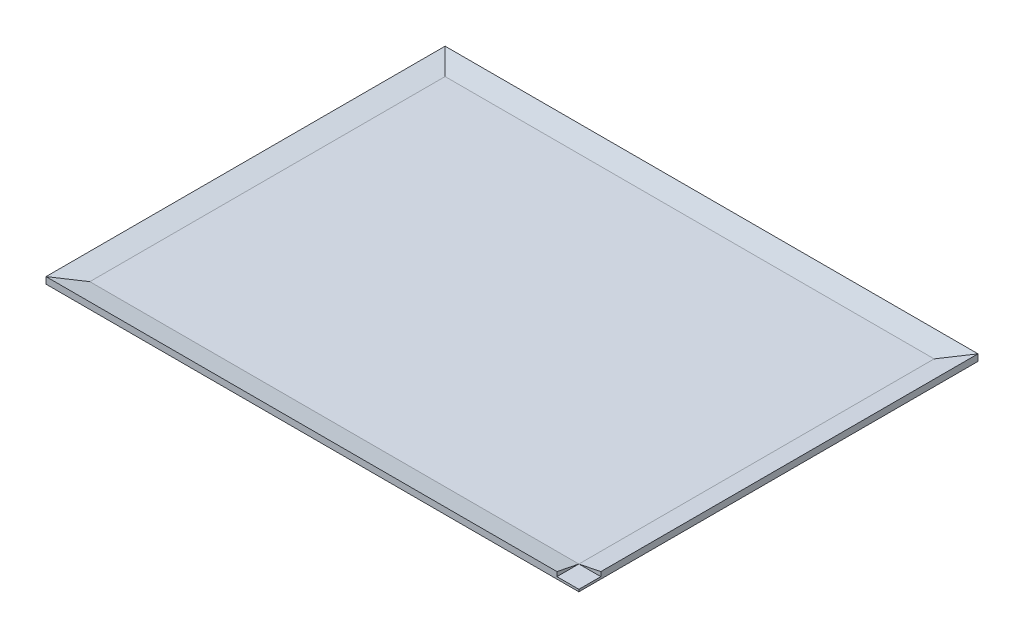
ISO-10303-21;
HEADER;
FILE_DESCRIPTION(('STEP AP214'),'2;1');
FILE_NAME('part.step','',(''),(''),'','','');
FILE_SCHEMA(('AUTOMOTIVE_DESIGN { 1 0 10303 214 1 1 1 1 }'));
ENDSEC;
DATA;
#1=APPLICATION_CONTEXT('core data for automotive mechanical design processes');
#2=APPLICATION_PROTOCOL_DEFINITION('international standard','automotive_design',2000,#1);
#3=PRODUCT_CONTEXT('',#1,'mechanical');
#4=PRODUCT('Part','Part','',(#3));
#5=PRODUCT_RELATED_PRODUCT_CATEGORY('part','',(#4));
#6=PRODUCT_DEFINITION_FORMATION('','',#4);
#7=PRODUCT_DEFINITION_CONTEXT('part definition',#1,'design');
#8=PRODUCT_DEFINITION('design','',#6,#7);
#9=PRODUCT_DEFINITION_SHAPE('','',#8);
#10=(LENGTH_UNIT() NAMED_UNIT(*) SI_UNIT(.MILLI.,.METRE.));
#11=(NAMED_UNIT(*) PLANE_ANGLE_UNIT() SI_UNIT($,.RADIAN.));
#12=(NAMED_UNIT(*) SI_UNIT($,.STERADIAN.) SOLID_ANGLE_UNIT());
#13=UNCERTAINTY_MEASURE_WITH_UNIT(LENGTH_MEASURE(1.E-05),#10,'distance_accuracy_value','');
#14=(GEOMETRIC_REPRESENTATION_CONTEXT(3) GLOBAL_UNCERTAINTY_ASSIGNED_CONTEXT((#13)) GLOBAL_UNIT_ASSIGNED_CONTEXT((#10,
#11,#12)) REPRESENTATION_CONTEXT('',''));
#15=CARTESIAN_POINT('',(0.,0.,0.));
#16=DIRECTION('',(0.,0.,1.));
#17=DIRECTION('',(1.,0.,0.));
#18=AXIS2_PLACEMENT_3D('',#15,#16,#17);
#19=CARTESIAN_POINT('',(0.,0.,0.));
#20=DIRECTION('',(0.,1.,0.));
#21=DIRECTION('',(0.,0.,1.));
#22=AXIS2_PLACEMENT_3D('',#19,#20,#21);
#23=PLANE('',#22);
#24=DIRECTION('',(-1.,0.,0.));
#25=VECTOR('',#24,1.);
#26=CARTESIAN_POINT('',(1115.,0.,810.));
#27=LINE('',#26,#25);
#28=CARTESIAN_POINT('',(1115.,0.,810.));
#29=VERTEX_POINT('',#28);
#30=CARTESIAN_POINT('',(-1115.,0.,810.));
#31=VERTEX_POINT('',#30);
#32=EDGE_CURVE('E145',#29,#31,#27,.T.);
#33=ORIENTED_EDGE('',*,*,#32,.F.);
#34=DIRECTION('',(0.,0.,1.));
#35=VECTOR('',#34,1.);
#36=CARTESIAN_POINT('',(1115.,0.,-920.1));
#37=LINE('',#36,#35);
#38=CARTESIAN_POINT('',(1115.,0.,-810.));
#39=VERTEX_POINT('',#38);
#40=EDGE_CURVE('E125',#39,#29,#37,.T.);
#41=ORIENTED_EDGE('',*,*,#40,.F.);
#42=DIRECTION('',(1.,0.,0.));
#43=VECTOR('',#42,1.);
#44=CARTESIAN_POINT('',(-1225.1,0.,-810.));
#45=LINE('',#44,#43);
#46=CARTESIAN_POINT('',(-1115.,0.,-810.));
#47=VERTEX_POINT('',#46);
#48=EDGE_CURVE('E118',#47,#39,#45,.T.);
#49=ORIENTED_EDGE('',*,*,#48,.F.);
#50=DIRECTION('',(0.,0.,-1.));
#51=VECTOR('',#50,1.);
#52=CARTESIAN_POINT('',(-1115.,0.,920.1));
#53=LINE('',#52,#51);
#54=EDGE_CURVE('E54',#31,#47,#53,.T.);
#55=ORIENTED_EDGE('',*,*,#54,.F.);
#56=EDGE_LOOP('',(#33,#41,#49,#55));
#57=FACE_BOUND('',#56,.T.);
#58=ADVANCED_FACE('F37',(#57),#23,.T.);
#59=CARTESIAN_POINT('',(-1215.,-10.,-910.));
#60=DIRECTION('',(-1.,0.,0.));
#61=DIRECTION('',(0.,0.,1.));
#62=AXIS2_PLACEMENT_3D('',#59,#60,#61);
#63=PLANE('',#62);
#64=DIRECTION('',(0.,0.,-1.));
#65=VECTOR('',#64,1.);
#66=CARTESIAN_POINT('',(-1215.,20.,920.1));
#67=LINE('',#66,#65);
#68=CARTESIAN_POINT('',(-1215.,20.,910.));
#69=VERTEX_POINT('',#68);
#70=CARTESIAN_POINT('',(-1215.,20.,-910.));
#71=VERTEX_POINT('',#70);
#72=EDGE_CURVE('E112',#69,#71,#67,.T.);
#73=ORIENTED_EDGE('',*,*,#72,.T.);
#74=DIRECTION('',(0.,1.,0.));
#75=VECTOR('',#74,1.);
#76=CARTESIAN_POINT('',(-1215.,-10.,-910.));
#77=LINE('',#76,#75);
#78=CARTESIAN_POINT('',(-1215.,-10.,-910.));
#79=VERTEX_POINT('',#78);
#80=EDGE_CURVE('E11',#79,#71,#77,.T.);
#81=ORIENTED_EDGE('',*,*,#80,.F.);
#82=DIRECTION('',(0.,0.,1.));
#83=VECTOR('',#82,1.);
#84=CARTESIAN_POINT('',(-1215.,-10.,-910.));
#85=LINE('',#84,#83);
#86=CARTESIAN_POINT('',(-1215.,-10.,910.));
#87=VERTEX_POINT('',#86);
#88=EDGE_CURVE('E156',#79,#87,#85,.T.);
#89=ORIENTED_EDGE('',*,*,#88,.T.);
#90=DIRECTION('',(0.,1.,0.));
#91=VECTOR('',#90,1.);
#92=CARTESIAN_POINT('',(-1215.,-10.,910.));
#93=LINE('',#92,#91);
#94=EDGE_CURVE('E41',#87,#69,#93,.T.);
#95=ORIENTED_EDGE('',*,*,#94,.T.);
#96=EDGE_LOOP('',(#73,#81,#89,#95));
#97=FACE_BOUND('',#96,.T.);
#98=ADVANCED_FACE('F39',(#97),#63,.T.);
#99=CARTESIAN_POINT('',(1215.,-10.,-910.));
#100=DIRECTION('',(0.,0.,-1.));
#101=DIRECTION('',(-1.,0.,0.));
#102=AXIS2_PLACEMENT_3D('',#99,#100,#101);
#103=PLANE('',#102);
#104=ORIENTED_EDGE('',*,*,#80,.T.);
#105=DIRECTION('',(1.,0.,0.));
#106=VECTOR('',#105,1.);
#107=CARTESIAN_POINT('',(-1225.1,20.,-910.));
#108=LINE('',#107,#106);
#109=CARTESIAN_POINT('',(1215.,20.,-910.));
#110=VERTEX_POINT('',#109);
#111=EDGE_CURVE('E121',#71,#110,#108,.T.);
#112=ORIENTED_EDGE('',*,*,#111,.T.);
#113=DIRECTION('',(0.,1.,0.));
#114=VECTOR('',#113,1.);
#115=CARTESIAN_POINT('',(1215.,-10.,-910.));
#116=LINE('',#115,#114);
#117=CARTESIAN_POINT('',(1215.,-10.,-910.));
#118=VERTEX_POINT('',#117);
#119=EDGE_CURVE('E46',#118,#110,#116,.T.);
#120=ORIENTED_EDGE('',*,*,#119,.F.);
#121=DIRECTION('',(-1.,0.,0.));
#122=VECTOR('',#121,1.);
#123=CARTESIAN_POINT('',(1215.,-10.,-910.));
#124=LINE('',#123,#122);
#125=EDGE_CURVE('E166',#118,#79,#124,.T.);
#126=ORIENTED_EDGE('',*,*,#125,.T.);
#127=EDGE_LOOP('',(#104,#112,#120,#126));
#128=FACE_BOUND('',#127,.T.);
#129=ADVANCED_FACE('F204',(#128),#103,.T.);
#130=CARTESIAN_POINT('',(1215.,-10.,910.));
#131=DIRECTION('',(1.,0.,0.));
#132=DIRECTION('',(0.,0.,-1.));
#133=AXIS2_PLACEMENT_3D('',#130,#131,#132);
#134=PLANE('',#133);
#135=DIRECTION('',(0.,0.,-1.));
#136=VECTOR('',#135,1.);
#137=CARTESIAN_POINT('',(1215.,0.,910.));
#138=LINE('',#137,#136);
#139=CARTESIAN_POINT('',(1215.,0.,910.));
#140=VERTEX_POINT('',#139);
#141=CARTESIAN_POINT('',(1215.,0.,810.));
#142=VERTEX_POINT('',#141);
#143=EDGE_CURVE('E160',#140,#142,#138,.T.);
#144=ORIENTED_EDGE('',*,*,#143,.F.);
#145=DIRECTION('',(0.,1.,0.));
#146=VECTOR('',#145,1.);
#147=CARTESIAN_POINT('',(1215.,-10.,910.));
#148=LINE('',#147,#146);
#149=CARTESIAN_POINT('',(1215.,-10.,910.));
#150=VERTEX_POINT('',#149);
#151=EDGE_CURVE('E172',#150,#140,#148,.T.);
#152=ORIENTED_EDGE('',*,*,#151,.F.);
#153=DIRECTION('',(0.,0.,-1.));
#154=VECTOR('',#153,1.);
#155=CARTESIAN_POINT('',(1215.,-10.,910.));
#156=LINE('',#155,#154);
#157=EDGE_CURVE('E163',#150,#118,#156,.T.);
#158=ORIENTED_EDGE('',*,*,#157,.T.);
#159=ORIENTED_EDGE('',*,*,#119,.T.);
#160=DIRECTION('',(0.,0.,1.));
#161=VECTOR('',#160,1.);
#162=CARTESIAN_POINT('',(1215.,20.,-920.1));
#163=LINE('',#162,#161);
#164=CARTESIAN_POINT('',(1215.,20.,810.));
#165=VERTEX_POINT('',#164);
#166=EDGE_CURVE('E136',#110,#165,#163,.T.);
#167=ORIENTED_EDGE('',*,*,#166,.T.);
#168=DIRECTION('',(0.,-1.,0.));
#169=VECTOR('',#168,1.);
#170=CARTESIAN_POINT('',(1215.,20.,810.));
#171=LINE('',#170,#169);
#172=EDGE_CURVE('E130',#165,#142,#171,.T.);
#173=ORIENTED_EDGE('',*,*,#172,.T.);
#174=EDGE_LOOP('',(#144,#152,#158,#159,#167,#173));
#175=FACE_BOUND('',#174,.T.);
#176=ADVANCED_FACE('F208',(#175),#134,.T.);
#177=CARTESIAN_POINT('',(-1215.,-10.,910.));
#178=DIRECTION('',(0.,0.,1.));
#179=DIRECTION('',(1.,0.,0.));
#180=AXIS2_PLACEMENT_3D('',#177,#178,#179);
#181=PLANE('',#180);
#182=DIRECTION('',(1.,0.,0.));
#183=VECTOR('',#182,1.);
#184=CARTESIAN_POINT('',(-1215.,0.,910.));
#185=LINE('',#184,#183);
#186=CARTESIAN_POINT('',(1115.,0.,910.));
#187=VERTEX_POINT('',#186);
#188=EDGE_CURVE('E141',#187,#140,#185,.T.);
#189=ORIENTED_EDGE('',*,*,#188,.F.);
#190=DIRECTION('',(0.,-1.,0.));
#191=VECTOR('',#190,1.);
#192=CARTESIAN_POINT('',(1115.,20.,910.));
#193=LINE('',#192,#191);
#194=CARTESIAN_POINT('',(1115.,20.,910.));
#195=VERTEX_POINT('',#194);
#196=EDGE_CURVE('E147',#195,#187,#193,.T.);
#197=ORIENTED_EDGE('',*,*,#196,.F.);
#198=DIRECTION('',(-1.,0.,0.));
#199=VECTOR('',#198,1.);
#200=CARTESIAN_POINT('',(1115.,20.,910.));
#201=LINE('',#200,#199);
#202=EDGE_CURVE('E142',#195,#69,#201,.T.);
#203=ORIENTED_EDGE('',*,*,#202,.T.);
#204=ORIENTED_EDGE('',*,*,#94,.F.);
#205=DIRECTION('',(1.,0.,0.));
#206=VECTOR('',#205,1.);
#207=CARTESIAN_POINT('',(-1215.,-10.,910.));
#208=LINE('',#207,#206);
#209=EDGE_CURVE('E159',#87,#150,#208,.T.);
#210=ORIENTED_EDGE('',*,*,#209,.T.);
#211=ORIENTED_EDGE('',*,*,#151,.T.);
#212=EDGE_LOOP('',(#189,#197,#203,#204,#210,#211));
#213=FACE_BOUND('',#212,.T.);
#214=ADVANCED_FACE('F183',(#213),#181,.T.);
#215=CARTESIAN_POINT('',(0.,-10.,0.));
#216=DIRECTION('',(0.,1.,0.));
#217=DIRECTION('',(0.,0.,1.));
#218=AXIS2_PLACEMENT_3D('',#215,#216,#217);
#219=PLANE('',#218);
#220=ORIENTED_EDGE('',*,*,#88,.F.);
#221=ORIENTED_EDGE('',*,*,#125,.F.);
#222=ORIENTED_EDGE('',*,*,#157,.F.);
#223=ORIENTED_EDGE('',*,*,#209,.F.);
#224=EDGE_LOOP('',(#220,#221,#222,#223));
#225=FACE_BOUND('',#224,.T.);
#226=ADVANCED_FACE('F194',(#225),#219,.F.);
#227=DIRECTION('',(-1.,0.,0.));
#228=VECTOR('',#227,1.);
#229=CARTESIAN_POINT('',(1215.,0.,810.));
#230=LINE('',#229,#228);
#231=EDGE_CURVE('E134',#142,#29,#230,.T.);
#232=ORIENTED_EDGE('',*,*,#231,.T.);
#233=DIRECTION('',(0.,0.,-1.));
#234=VECTOR('',#233,1.);
#235=CARTESIAN_POINT('',(1115.,0.,910.));
#236=LINE('',#235,#234);
#237=EDGE_CURVE('E62',#187,#29,#236,.T.);
#238=ORIENTED_EDGE('',*,*,#237,.F.);
#239=ORIENTED_EDGE('',*,*,#188,.T.);
#240=ORIENTED_EDGE('',*,*,#143,.T.);
#241=EDGE_LOOP('',(#232,#238,#239,#240));
#242=FACE_BOUND('',#241,.T.);
#243=ADVANCED_FACE('F187',(#242),#23,.T.);
#244=CARTESIAN_POINT('',(1115.,0.,-305.));
#245=DIRECTION('',(-1.,0.,0.));
#246=DIRECTION('',(0.,0.,1.));
#247=AXIS2_PLACEMENT_3D('',#244,#245,#246);
#248=PLANE('',#247);
#249=ORIENTED_EDGE('',*,*,#237,.T.);
#250=DIRECTION('',(0.,0.196116135138184,0.98058067569092));
#251=VECTOR('',#250,1.);
#252=CARTESIAN_POINT('',(1115.,0.,810.));
#253=LINE('',#252,#251);
#254=EDGE_CURVE('E144',#29,#195,#253,.T.);
#255=ORIENTED_EDGE('',*,*,#254,.T.);
#256=ORIENTED_EDGE('',*,*,#196,.T.);
#257=EDGE_LOOP('',(#249,#255,#256));
#258=FACE_BOUND('',#257,.T.);
#259=ADVANCED_FACE('F185',(#258),#248,.F.);
#260=CARTESIAN_POINT('',(-1115.,0.,920.1));
#261=DIRECTION('',(-0.196116135138184,-0.98058067569092,0.));
#262=DIRECTION('',(0.98058067569092,-0.196116135138184,0.));
#263=AXIS2_PLACEMENT_3D('',#260,#261,#262);
#264=PLANE('',#263);
#265=DIRECTION('',(0.700140042014005,-0.140028008402801,-0.700140042014005));
#266=VECTOR('',#265,1.);
#267=CARTESIAN_POINT('',(-21.8627450980391,-218.627450980392,-283.137254901961));
#268=LINE('',#267,#266);
#269=EDGE_CURVE('E110',#69,#31,#268,.T.);
#270=ORIENTED_EDGE('',*,*,#269,.T.);
#271=ORIENTED_EDGE('',*,*,#54,.T.);
#272=DIRECTION('',(0.700140042014005,-0.140028008402801,0.700140042014005));
#273=VECTOR('',#272,1.);
#274=CARTESIAN_POINT('',(-717.941176470588,-79.4117647058823,-412.941176470588));
#275=LINE('',#274,#273);
#276=EDGE_CURVE('E107',#71,#47,#275,.T.);
#277=ORIENTED_EDGE('',*,*,#276,.F.);
#278=ORIENTED_EDGE('',*,*,#72,.F.);
#279=EDGE_LOOP('',(#270,#271,#277,#278));
#280=FACE_BOUND('',#279,.T.);
#281=ADVANCED_FACE('F105',(#280),#264,.F.);
#282=CARTESIAN_POINT('',(1115.,0.,810.));
#283=DIRECTION('',(0.,-0.98058067569092,0.196116135138184));
#284=DIRECTION('',(0.,-0.196116135138184,-0.98058067569092));
#285=AXIS2_PLACEMENT_3D('',#282,#283,#284);
#286=PLANE('',#285);
#287=ORIENTED_EDGE('',*,*,#202,.F.);
#288=ORIENTED_EDGE('',*,*,#254,.F.);
#289=ORIENTED_EDGE('',*,*,#32,.T.);
#290=ORIENTED_EDGE('',*,*,#269,.F.);
#291=EDGE_LOOP('',(#287,#288,#289,#290));
#292=FACE_BOUND('',#291,.T.);
#293=ADVANCED_FACE('F181',(#292),#286,.F.);
#294=CARTESIAN_POINT('',(-2.22044604925031E-13,0.,810.));
#295=DIRECTION('',(0.,0.,1.));
#296=DIRECTION('',(1.,0.,0.));
#297=AXIS2_PLACEMENT_3D('',#294,#295,#296);
#298=PLANE('',#297);
#299=ORIENTED_EDGE('',*,*,#231,.F.);
#300=ORIENTED_EDGE('',*,*,#172,.F.);
#301=DIRECTION('',(0.98058067569092,0.196116135138184,0.));
#302=VECTOR('',#301,1.);
#303=CARTESIAN_POINT('',(1115.,0.,810.));
#304=LINE('',#303,#302);
#305=EDGE_CURVE('E132',#29,#165,#304,.T.);
#306=ORIENTED_EDGE('',*,*,#305,.F.);
#307=EDGE_LOOP('',(#299,#300,#306));
#308=FACE_BOUND('',#307,.T.);
#309=ADVANCED_FACE('F224',(#308),#298,.T.);
#310=CARTESIAN_POINT('',(1115.,0.,-920.1));
#311=DIRECTION('',(0.196116135138184,-0.98058067569092,0.));
#312=DIRECTION('',(0.98058067569092,0.196116135138184,0.));
#313=AXIS2_PLACEMENT_3D('',#310,#311,#312);
#314=PLANE('',#313);
#315=DIRECTION('',(-0.700140042014005,-0.140028008402801,0.700140042014005));
#316=VECTOR('',#315,1.);
#317=CARTESIAN_POINT('',(-32.107843137255,-229.421568627451,337.107843137255));
#318=LINE('',#317,#316);
#319=EDGE_CURVE('E122',#110,#39,#318,.T.);
#320=ORIENTED_EDGE('',*,*,#319,.T.);
#321=ORIENTED_EDGE('',*,*,#40,.T.);
#322=ORIENTED_EDGE('',*,*,#305,.T.);
#323=ORIENTED_EDGE('',*,*,#166,.F.);
#324=EDGE_LOOP('',(#320,#321,#322,#323));
#325=FACE_BOUND('',#324,.T.);
#326=ADVANCED_FACE('F198',(#325),#314,.F.);
#327=CARTESIAN_POINT('',(-1225.1,0.,-810.));
#328=DIRECTION('',(0.,-0.98058067569092,-0.196116135138184));
#329=DIRECTION('',(0.,0.196116135138184,-0.98058067569092));
#330=AXIS2_PLACEMENT_3D('',#327,#328,#329);
#331=PLANE('',#330);
#332=ORIENTED_EDGE('',*,*,#111,.F.);
#333=ORIENTED_EDGE('',*,*,#276,.T.);
#334=ORIENTED_EDGE('',*,*,#48,.T.);
#335=ORIENTED_EDGE('',*,*,#319,.F.);
#336=EDGE_LOOP('',(#332,#333,#334,#335));
#337=FACE_BOUND('',#336,.T.);
#338=ADVANCED_FACE('F116',(#337),#331,.F.);
#339=CLOSED_SHELL('',(#58,#98,#129,#176,#214,#226,#243,#259,#281,#293,#309,#326,#338));
#340=MANIFOLD_SOLID_BREP('B2',#339);
#341=ADVANCED_BREP_SHAPE_REPRESENTATION('',(#18,#340),#14);
#342=SHAPE_DEFINITION_REPRESENTATION(#9,#341);
ENDSEC;
END-ISO-10303-21;
